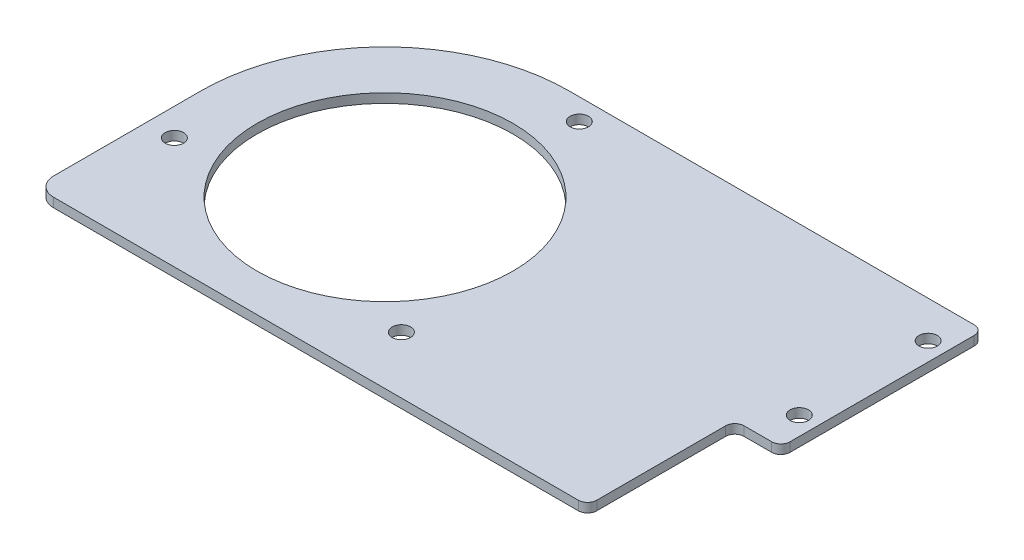
ISO-10303-21;
HEADER;
FILE_DESCRIPTION(('STEP AP214'),'2;1');
FILE_NAME('part.step','',(''),(''),'','','');
FILE_SCHEMA(('AUTOMOTIVE_DESIGN { 1 0 10303 214 1 1 1 1 }'));
ENDSEC;
DATA;
#1=APPLICATION_CONTEXT('core data for automotive mechanical design processes');
#2=APPLICATION_PROTOCOL_DEFINITION('international standard','automotive_design',2000,#1);
#3=PRODUCT_CONTEXT('',#1,'mechanical');
#4=PRODUCT('Part','Part','',(#3));
#5=PRODUCT_RELATED_PRODUCT_CATEGORY('part','',(#4));
#6=PRODUCT_DEFINITION_FORMATION('','',#4);
#7=PRODUCT_DEFINITION_CONTEXT('part definition',#1,'design');
#8=PRODUCT_DEFINITION('design','',#6,#7);
#9=PRODUCT_DEFINITION_SHAPE('','',#8);
#10=(LENGTH_UNIT() NAMED_UNIT(*) SI_UNIT(.MILLI.,.METRE.));
#11=(NAMED_UNIT(*) PLANE_ANGLE_UNIT() SI_UNIT($,.RADIAN.));
#12=(NAMED_UNIT(*) SI_UNIT($,.STERADIAN.) SOLID_ANGLE_UNIT());
#13=UNCERTAINTY_MEASURE_WITH_UNIT(LENGTH_MEASURE(1.E-05),#10,'distance_accuracy_value','');
#14=(GEOMETRIC_REPRESENTATION_CONTEXT(3) GLOBAL_UNCERTAINTY_ASSIGNED_CONTEXT((#13)) GLOBAL_UNIT_ASSIGNED_CONTEXT((#10,
#11,#12)) REPRESENTATION_CONTEXT('',''));
#15=CARTESIAN_POINT('',(0.,0.,0.));
#16=DIRECTION('',(0.,0.,1.));
#17=DIRECTION('',(1.,0.,0.));
#18=AXIS2_PLACEMENT_3D('',#15,#16,#17);
#19=CARTESIAN_POINT('',(-114.3,6.35,101.6));
#20=DIRECTION('',(0.,-1.,0.));
#21=DIRECTION('',(0.,0.,-1.));
#22=AXIS2_PLACEMENT_3D('',#19,#20,#21);
#23=PLANE('',#22);
#24=CARTESIAN_POINT('',(21.8094681715398,6.35,-112.199987068068));
#25=DIRECTION('',(0.,1.,0.));
#26=DIRECTION('',(0.,0.,1.));
#27=AXIS2_PLACEMENT_3D('',#24,#25,#26);
#28=CIRCLE('',#27,6.34999999999998);
#29=CARTESIAN_POINT('',(21.8094681715398,6.35,-105.849987068068));
#30=VERTEX_POINT('',#29);
#31=EDGE_CURVE('E307',#30,#30,#28,.T.);
#32=ORIENTED_EDGE('',*,*,#31,.F.);
#33=EDGE_LOOP('',(#32));
#34=FACE_BOUND('',#33,.T.);
#35=CARTESIAN_POINT('',(273.05,6.35,-101.6));
#36=DIRECTION('',(0.,1.,0.));
#37=DIRECTION('',(0.,0.,1.));
#38=AXIS2_PLACEMENT_3D('',#35,#36,#37);
#39=CIRCLE('',#38,6.35);
#40=CARTESIAN_POINT('',(273.05,6.35,-95.2500000000001));
#41=VERTEX_POINT('',#40);
#42=EDGE_CURVE('E297',#41,#41,#39,.T.);
#43=ORIENTED_EDGE('',*,*,#42,.F.);
#44=EDGE_LOOP('',(#43));
#45=FACE_BOUND('',#44,.T.);
#46=CARTESIAN_POINT('',(0.,6.35,0.));
#47=DIRECTION('',(0.,1.,0.));
#48=DIRECTION('',(0.,0.,1.));
#49=AXIS2_PLACEMENT_3D('',#46,#47,#48);
#50=CIRCLE('',#49,88.265);
#51=CARTESIAN_POINT('',(0.,6.35,88.265));
#52=VERTEX_POINT('',#51);
#53=EDGE_CURVE('E194',#52,#52,#50,.T.);
#54=ORIENTED_EDGE('',*,*,#53,.F.);
#55=EDGE_LOOP('',(#54));
#56=FACE_BOUND('',#55,.T.);
#57=CARTESIAN_POINT('',(-114.3,6.35,101.6));
#58=DIRECTION('',(0.,1.,0.));
#59=DIRECTION('',(0.,0.,-1.));
#60=AXIS2_PLACEMENT_3D('',#57,#58,#59);
#61=CIRCLE('',#60,12.7);
#62=CARTESIAN_POINT('',(-127.,6.35,101.6));
#63=VERTEX_POINT('',#62);
#64=CARTESIAN_POINT('',(-114.3,6.35,114.3));
#65=VERTEX_POINT('',#64);
#66=EDGE_CURVE('E224',#63,#65,#61,.T.);
#67=ORIENTED_EDGE('',*,*,#66,.T.);
#68=DIRECTION('',(1.,0.,0.));
#69=VECTOR('',#68,1.);
#70=CARTESIAN_POINT('',(247.65,6.35,114.3));
#71=LINE('',#70,#69);
#72=CARTESIAN_POINT('',(247.65,6.35,114.3));
#73=VERTEX_POINT('',#72);
#74=EDGE_CURVE('E127',#65,#73,#71,.T.);
#75=ORIENTED_EDGE('',*,*,#74,.T.);
#76=CARTESIAN_POINT('',(247.65,6.35,107.95));
#77=DIRECTION('',(0.,1.,0.));
#78=DIRECTION('',(0.,0.,1.));
#79=AXIS2_PLACEMENT_3D('',#76,#77,#78);
#80=CIRCLE('',#79,6.35000000000003);
#81=CARTESIAN_POINT('',(254.,6.35,107.95));
#82=VERTEX_POINT('',#81);
#83=EDGE_CURVE('E261',#73,#82,#80,.T.);
#84=ORIENTED_EDGE('',*,*,#83,.T.);
#85=DIRECTION('',(0.,0.,-1.));
#86=VECTOR('',#85,1.);
#87=CARTESIAN_POINT('',(254.,6.35,107.95));
#88=LINE('',#87,#86);
#89=CARTESIAN_POINT('',(254.,6.35,19.05));
#90=VERTEX_POINT('',#89);
#91=EDGE_CURVE('E281',#82,#90,#88,.T.);
#92=ORIENTED_EDGE('',*,*,#91,.T.);
#93=CARTESIAN_POINT('',(260.35,6.35,19.05));
#94=DIRECTION('',(0.,-1.,0.));
#95=DIRECTION('',(0.,0.,1.));
#96=AXIS2_PLACEMENT_3D('',#93,#94,#95);
#97=CIRCLE('',#96,6.35000000000001);
#98=CARTESIAN_POINT('',(260.35,6.35,12.7));
#99=VERTEX_POINT('',#98);
#100=EDGE_CURVE('E277',#90,#99,#97,.T.);
#101=ORIENTED_EDGE('',*,*,#100,.T.);
#102=DIRECTION('',(1.,0.,0.));
#103=VECTOR('',#102,1.);
#104=CARTESIAN_POINT('',(260.35,6.35,12.7));
#105=LINE('',#104,#103);
#106=CARTESIAN_POINT('',(279.4,6.35,12.7));
#107=VERTEX_POINT('',#106);
#108=EDGE_CURVE('E280',#99,#107,#105,.T.);
#109=ORIENTED_EDGE('',*,*,#108,.T.);
#110=CARTESIAN_POINT('',(279.4,6.35,6.35));
#111=DIRECTION('',(0.,1.,0.));
#112=DIRECTION('',(0.,0.,-1.));
#113=AXIS2_PLACEMENT_3D('',#110,#111,#112);
#114=CIRCLE('',#113,6.35000000000001);
#115=CARTESIAN_POINT('',(285.75,6.35,6.34999999999996));
#116=VERTEX_POINT('',#115);
#117=EDGE_CURVE('E285',#107,#116,#114,.T.);
#118=ORIENTED_EDGE('',*,*,#117,.T.);
#119=DIRECTION('',(0.,0.,-1.));
#120=VECTOR('',#119,1.);
#121=CARTESIAN_POINT('',(285.75,6.35,-120.65));
#122=LINE('',#121,#120);
#123=CARTESIAN_POINT('',(285.75,6.35,-120.65));
#124=VERTEX_POINT('',#123);
#125=EDGE_CURVE('E293',#116,#124,#122,.T.);
#126=ORIENTED_EDGE('',*,*,#125,.T.);
#127=CARTESIAN_POINT('',(279.4,6.35,-120.65));
#128=DIRECTION('',(0.,1.,0.));
#129=DIRECTION('',(0.,0.,-1.));
#130=AXIS2_PLACEMENT_3D('',#127,#128,#129);
#131=CIRCLE('',#130,6.35000000000001);
#132=CARTESIAN_POINT('',(279.4,6.35,-127.));
#133=VERTEX_POINT('',#132);
#134=EDGE_CURVE('E166',#124,#133,#131,.T.);
#135=ORIENTED_EDGE('',*,*,#134,.T.);
#136=DIRECTION('',(-1.,0.,0.));
#137=VECTOR('',#136,1.);
#138=CARTESIAN_POINT('',(279.4,6.35,-127.));
#139=LINE('',#138,#137);
#140=CARTESIAN_POINT('',(0.,6.35,-127.));
#141=VERTEX_POINT('',#140);
#142=EDGE_CURVE('E160',#133,#141,#139,.T.);
#143=ORIENTED_EDGE('',*,*,#142,.T.);
#144=CARTESIAN_POINT('',(0.,6.35,0.));
#145=DIRECTION('',(0.,1.,0.));
#146=DIRECTION('',(0.,0.,-1.));
#147=AXIS2_PLACEMENT_3D('',#144,#145,#146);
#148=CIRCLE('',#147,127.);
#149=CARTESIAN_POINT('',(-127.,6.35,0.));
#150=VERTEX_POINT('',#149);
#151=EDGE_CURVE('E164',#141,#150,#148,.T.);
#152=ORIENTED_EDGE('',*,*,#151,.T.);
#153=DIRECTION('',(0.,0.,1.));
#154=VECTOR('',#153,1.);
#155=CARTESIAN_POINT('',(-127.,6.35,0.));
#156=LINE('',#155,#154);
#157=EDGE_CURVE('E59',#150,#63,#156,.T.);
#158=ORIENTED_EDGE('',*,*,#157,.T.);
#159=EDGE_LOOP('',(#67,#75,#84,#92,#101,#109,#118,#126,#135,#143,#152,#158));
#160=FACE_BOUND('',#159,.T.);
#161=CARTESIAN_POINT('',(-108.072773191002,6.35,37.2124400544523));
#162=DIRECTION('',(0.,1.,0.));
#163=DIRECTION('',(0.,0.,1.));
#164=AXIS2_PLACEMENT_3D('',#161,#162,#163);
#165=CIRCLE('',#164,6.35);
#166=CARTESIAN_POINT('',(-108.072773191002,6.35,43.5624400544523));
#167=VERTEX_POINT('',#166);
#168=EDGE_CURVE('E321',#167,#167,#165,.T.);
#169=ORIENTED_EDGE('',*,*,#168,.F.);
#170=EDGE_LOOP('',(#169));
#171=FACE_BOUND('',#170,.T.);
#172=CARTESIAN_POINT('',(273.05,6.35,-12.7));
#173=DIRECTION('',(0.,1.,0.));
#174=DIRECTION('',(0.,0.,1.));
#175=AXIS2_PLACEMENT_3D('',#172,#173,#174);
#176=CIRCLE('',#175,6.35);
#177=CARTESIAN_POINT('',(273.05,6.35,-6.35));
#178=VERTEX_POINT('',#177);
#179=EDGE_CURVE('E304',#178,#178,#176,.T.);
#180=ORIENTED_EDGE('',*,*,#179,.F.);
#181=EDGE_LOOP('',(#180));
#182=FACE_BOUND('',#181,.T.);
#183=CARTESIAN_POINT('',(86.2633050194624,6.35,74.9875470136155));
#184=DIRECTION('',(0.,1.,0.));
#185=DIRECTION('',(0.,0.,1.));
#186=AXIS2_PLACEMENT_3D('',#183,#184,#185);
#187=CIRCLE('',#186,6.34999999999999);
#188=CARTESIAN_POINT('',(86.2633050194624,6.35,81.3375470136155));
#189=VERTEX_POINT('',#188);
#190=EDGE_CURVE('E315',#189,#189,#187,.T.);
#191=ORIENTED_EDGE('',*,*,#190,.F.);
#192=EDGE_LOOP('',(#191));
#193=FACE_BOUND('',#192,.T.);
#194=ADVANCED_FACE('F38',(#34,#45,#56,#160,#171,#182,#193),#23,.F.);
#195=CARTESIAN_POINT('',(-114.3,0.,101.6));
#196=DIRECTION('',(0.,-1.,0.));
#197=DIRECTION('',(0.,0.,-1.));
#198=AXIS2_PLACEMENT_3D('',#195,#196,#197);
#199=PLANE('',#198);
#200=CARTESIAN_POINT('',(21.8094681715398,0.,-112.199987068068));
#201=DIRECTION('',(0.,1.,0.));
#202=DIRECTION('',(0.,0.,1.));
#203=AXIS2_PLACEMENT_3D('',#200,#201,#202);
#204=CIRCLE('',#203,6.34999999999998);
#205=CARTESIAN_POINT('',(21.8094681715398,0.,-105.849987068068));
#206=VERTEX_POINT('',#205);
#207=EDGE_CURVE('E311',#206,#206,#204,.T.);
#208=ORIENTED_EDGE('',*,*,#207,.T.);
#209=EDGE_LOOP('',(#208));
#210=FACE_BOUND('',#209,.T.);
#211=CARTESIAN_POINT('',(273.05,0.,-101.6));
#212=DIRECTION('',(0.,1.,0.));
#213=DIRECTION('',(0.,0.,1.));
#214=AXIS2_PLACEMENT_3D('',#211,#212,#213);
#215=CIRCLE('',#214,6.35);
#216=CARTESIAN_POINT('',(273.05,0.,-95.2500000000001));
#217=VERTEX_POINT('',#216);
#218=EDGE_CURVE('E300',#217,#217,#215,.T.);
#219=ORIENTED_EDGE('',*,*,#218,.T.);
#220=EDGE_LOOP('',(#219));
#221=FACE_BOUND('',#220,.T.);
#222=CARTESIAN_POINT('',(0.,0.,0.));
#223=DIRECTION('',(0.,1.,0.));
#224=DIRECTION('',(0.,0.,1.));
#225=AXIS2_PLACEMENT_3D('',#222,#223,#224);
#226=CIRCLE('',#225,88.265);
#227=CARTESIAN_POINT('',(0.,0.,88.265));
#228=VERTEX_POINT('',#227);
#229=EDGE_CURVE('E318',#228,#228,#226,.T.);
#230=ORIENTED_EDGE('',*,*,#229,.T.);
#231=EDGE_LOOP('',(#230));
#232=FACE_BOUND('',#231,.T.);
#233=CARTESIAN_POINT('',(-114.3,0.,101.6));
#234=DIRECTION('',(0.,1.,0.));
#235=DIRECTION('',(0.,0.,-1.));
#236=AXIS2_PLACEMENT_3D('',#233,#234,#235);
#237=CIRCLE('',#236,12.7);
#238=CARTESIAN_POINT('',(-127.,0.,101.6));
#239=VERTEX_POINT('',#238);
#240=CARTESIAN_POINT('',(-114.3,0.,114.3));
#241=VERTEX_POINT('',#240);
#242=EDGE_CURVE('E189',#239,#241,#237,.T.);
#243=ORIENTED_EDGE('',*,*,#242,.F.);
#244=DIRECTION('',(0.,0.,1.));
#245=VECTOR('',#244,1.);
#246=CARTESIAN_POINT('',(-127.,0.,0.));
#247=LINE('',#246,#245);
#248=CARTESIAN_POINT('',(-127.,0.,0.));
#249=VERTEX_POINT('',#248);
#250=EDGE_CURVE('E119',#249,#239,#247,.T.);
#251=ORIENTED_EDGE('',*,*,#250,.F.);
#252=CARTESIAN_POINT('',(0.,0.,0.));
#253=DIRECTION('',(0.,1.,0.));
#254=DIRECTION('',(0.,0.,-1.));
#255=AXIS2_PLACEMENT_3D('',#252,#253,#254);
#256=CIRCLE('',#255,127.);
#257=CARTESIAN_POINT('',(0.,0.,-127.));
#258=VERTEX_POINT('',#257);
#259=EDGE_CURVE('E112',#258,#249,#256,.T.);
#260=ORIENTED_EDGE('',*,*,#259,.F.);
#261=DIRECTION('',(-1.,0.,0.));
#262=VECTOR('',#261,1.);
#263=CARTESIAN_POINT('',(279.4,0.,-127.));
#264=LINE('',#263,#262);
#265=CARTESIAN_POINT('',(279.4,0.,-127.));
#266=VERTEX_POINT('',#265);
#267=EDGE_CURVE('E175',#266,#258,#264,.T.);
#268=ORIENTED_EDGE('',*,*,#267,.F.);
#269=CARTESIAN_POINT('',(279.4,0.,-120.65));
#270=DIRECTION('',(0.,1.,0.));
#271=DIRECTION('',(0.,0.,-1.));
#272=AXIS2_PLACEMENT_3D('',#269,#270,#271);
#273=CIRCLE('',#272,6.35000000000001);
#274=CARTESIAN_POINT('',(285.75,0.,-120.65));
#275=VERTEX_POINT('',#274);
#276=EDGE_CURVE('E215',#275,#266,#273,.T.);
#277=ORIENTED_EDGE('',*,*,#276,.F.);
#278=DIRECTION('',(0.,0.,-1.));
#279=VECTOR('',#278,1.);
#280=CARTESIAN_POINT('',(285.75,0.,-120.65));
#281=LINE('',#280,#279);
#282=CARTESIAN_POINT('',(285.75,0.,6.34999999999996));
#283=VERTEX_POINT('',#282);
#284=EDGE_CURVE('E212',#283,#275,#281,.T.);
#285=ORIENTED_EDGE('',*,*,#284,.F.);
#286=CARTESIAN_POINT('',(279.4,0.,6.35));
#287=DIRECTION('',(0.,1.,0.));
#288=DIRECTION('',(0.,0.,-1.));
#289=AXIS2_PLACEMENT_3D('',#286,#287,#288);
#290=CIRCLE('',#289,6.35000000000001);
#291=CARTESIAN_POINT('',(279.4,0.,12.7));
#292=VERTEX_POINT('',#291);
#293=EDGE_CURVE('E209',#292,#283,#290,.T.);
#294=ORIENTED_EDGE('',*,*,#293,.F.);
#295=DIRECTION('',(1.,0.,0.));
#296=VECTOR('',#295,1.);
#297=CARTESIAN_POINT('',(260.35,0.,12.7));
#298=LINE('',#297,#296);
#299=CARTESIAN_POINT('',(260.35,0.,12.7));
#300=VERTEX_POINT('',#299);
#301=EDGE_CURVE('E206',#300,#292,#298,.T.);
#302=ORIENTED_EDGE('',*,*,#301,.F.);
#303=CARTESIAN_POINT('',(260.35,0.,19.05));
#304=DIRECTION('',(0.,-1.,0.));
#305=DIRECTION('',(0.,0.,1.));
#306=AXIS2_PLACEMENT_3D('',#303,#304,#305);
#307=CIRCLE('',#306,6.35000000000001);
#308=CARTESIAN_POINT('',(254.,0.,19.05));
#309=VERTEX_POINT('',#308);
#310=EDGE_CURVE('E203',#309,#300,#307,.T.);
#311=ORIENTED_EDGE('',*,*,#310,.F.);
#312=DIRECTION('',(0.,0.,-1.));
#313=VECTOR('',#312,1.);
#314=CARTESIAN_POINT('',(254.,0.,107.95));
#315=LINE('',#314,#313);
#316=CARTESIAN_POINT('',(254.,0.,107.95));
#317=VERTEX_POINT('',#316);
#318=EDGE_CURVE('E200',#317,#309,#315,.T.);
#319=ORIENTED_EDGE('',*,*,#318,.F.);
#320=CARTESIAN_POINT('',(247.65,0.,107.95));
#321=DIRECTION('',(0.,1.,0.));
#322=DIRECTION('',(0.,0.,1.));
#323=AXIS2_PLACEMENT_3D('',#320,#321,#322);
#324=CIRCLE('',#323,6.35000000000003);
#325=CARTESIAN_POINT('',(247.65,0.,114.3));
#326=VERTEX_POINT('',#325);
#327=EDGE_CURVE('E197',#326,#317,#324,.T.);
#328=ORIENTED_EDGE('',*,*,#327,.F.);
#329=DIRECTION('',(1.,0.,0.));
#330=VECTOR('',#329,1.);
#331=CARTESIAN_POINT('',(247.65,0.,114.3));
#332=LINE('',#331,#330);
#333=EDGE_CURVE('E193',#241,#326,#332,.T.);
#334=ORIENTED_EDGE('',*,*,#333,.F.);
#335=EDGE_LOOP('',(#243,#251,#260,#268,#277,#285,#294,#302,#311,#319,#328,#334));
#336=FACE_BOUND('',#335,.T.);
#337=CARTESIAN_POINT('',(-108.072773191002,0.,37.2124400544523));
#338=DIRECTION('',(0.,1.,0.));
#339=DIRECTION('',(0.,0.,1.));
#340=AXIS2_PLACEMENT_3D('',#337,#338,#339);
#341=CIRCLE('',#340,6.35);
#342=CARTESIAN_POINT('',(-108.072773191002,0.,43.5624400544523));
#343=VERTEX_POINT('',#342);
#344=EDGE_CURVE('E299',#343,#343,#341,.T.);
#345=ORIENTED_EDGE('',*,*,#344,.T.);
#346=EDGE_LOOP('',(#345));
#347=FACE_BOUND('',#346,.T.);
#348=CARTESIAN_POINT('',(273.05,0.,-12.7));
#349=DIRECTION('',(0.,1.,0.));
#350=DIRECTION('',(0.,0.,1.));
#351=AXIS2_PLACEMENT_3D('',#348,#349,#350);
#352=CIRCLE('',#351,6.35);
#353=CARTESIAN_POINT('',(273.05,0.,-6.35));
#354=VERTEX_POINT('',#353);
#355=EDGE_CURVE('E310',#354,#354,#352,.T.);
#356=ORIENTED_EDGE('',*,*,#355,.T.);
#357=EDGE_LOOP('',(#356));
#358=FACE_BOUND('',#357,.T.);
#359=CARTESIAN_POINT('',(86.2633050194624,0.,74.9875470136155));
#360=DIRECTION('',(0.,1.,0.));
#361=DIRECTION('',(0.,0.,1.));
#362=AXIS2_PLACEMENT_3D('',#359,#360,#361);
#363=CIRCLE('',#362,6.34999999999999);
#364=CARTESIAN_POINT('',(86.2633050194624,0.,81.3375470136155));
#365=VERTEX_POINT('',#364);
#366=EDGE_CURVE('E531',#365,#365,#363,.T.);
#367=ORIENTED_EDGE('',*,*,#366,.T.);
#368=EDGE_LOOP('',(#367));
#369=FACE_BOUND('',#368,.T.);
#370=ADVANCED_FACE('F265',(#210,#221,#232,#336,#347,#358,#369),#199,.T.);
#371=CARTESIAN_POINT('',(-114.3,6.35,101.6));
#372=DIRECTION('',(0.,-1.,0.));
#373=DIRECTION('',(0.,0.,-1.));
#374=AXIS2_PLACEMENT_3D('',#371,#372,#373);
#375=CYLINDRICAL_SURFACE('',#374,12.7);
#376=ORIENTED_EDGE('',*,*,#242,.T.);
#377=DIRECTION('',(0.,-1.,0.));
#378=VECTOR('',#377,1.);
#379=CARTESIAN_POINT('',(-114.3,6.35,114.3));
#380=LINE('',#379,#378);
#381=EDGE_CURVE('E11',#65,#241,#380,.T.);
#382=ORIENTED_EDGE('',*,*,#381,.F.);
#383=ORIENTED_EDGE('',*,*,#66,.F.);
#384=DIRECTION('',(0.,-1.,0.));
#385=VECTOR('',#384,1.);
#386=CARTESIAN_POINT('',(-127.,6.35,101.6));
#387=LINE('',#386,#385);
#388=EDGE_CURVE('E185',#63,#239,#387,.T.);
#389=ORIENTED_EDGE('',*,*,#388,.T.);
#390=EDGE_LOOP('',(#376,#382,#383,#389));
#391=FACE_BOUND('',#390,.T.);
#392=ADVANCED_FACE('F40',(#391),#375,.T.);
#393=CARTESIAN_POINT('',(247.65,6.35,114.3));
#394=DIRECTION('',(0.,0.,-1.));
#395=DIRECTION('',(-1.,0.,0.));
#396=AXIS2_PLACEMENT_3D('',#393,#394,#395);
#397=PLANE('',#396);
#398=ORIENTED_EDGE('',*,*,#333,.T.);
#399=DIRECTION('',(0.,-1.,0.));
#400=VECTOR('',#399,1.);
#401=CARTESIAN_POINT('',(247.65,6.35,114.3));
#402=LINE('',#401,#400);
#403=EDGE_CURVE('E48',#73,#326,#402,.T.);
#404=ORIENTED_EDGE('',*,*,#403,.F.);
#405=ORIENTED_EDGE('',*,*,#74,.F.);
#406=ORIENTED_EDGE('',*,*,#381,.T.);
#407=EDGE_LOOP('',(#398,#404,#405,#406));
#408=FACE_BOUND('',#407,.T.);
#409=ADVANCED_FACE('F337',(#408),#397,.F.);
#410=CARTESIAN_POINT('',(247.65,6.35,107.95));
#411=DIRECTION('',(0.,-1.,0.));
#412=DIRECTION('',(0.,0.,-1.));
#413=AXIS2_PLACEMENT_3D('',#410,#411,#412);
#414=CYLINDRICAL_SURFACE('',#413,6.35000000000003);
#415=ORIENTED_EDGE('',*,*,#327,.T.);
#416=DIRECTION('',(0.,-1.,0.));
#417=VECTOR('',#416,1.);
#418=CARTESIAN_POINT('',(254.,6.35,107.95));
#419=LINE('',#418,#417);
#420=EDGE_CURVE('E251',#82,#317,#419,.T.);
#421=ORIENTED_EDGE('',*,*,#420,.F.);
#422=ORIENTED_EDGE('',*,*,#83,.F.);
#423=ORIENTED_EDGE('',*,*,#403,.T.);
#424=EDGE_LOOP('',(#415,#421,#422,#423));
#425=FACE_BOUND('',#424,.T.);
#426=ADVANCED_FACE('F259',(#425),#414,.T.);
#427=CARTESIAN_POINT('',(254.,6.35,107.95));
#428=DIRECTION('',(-1.,0.,0.));
#429=DIRECTION('',(0.,0.,1.));
#430=AXIS2_PLACEMENT_3D('',#427,#428,#429);
#431=PLANE('',#430);
#432=ORIENTED_EDGE('',*,*,#318,.T.);
#433=DIRECTION('',(0.,-1.,0.));
#434=VECTOR('',#433,1.);
#435=CARTESIAN_POINT('',(254.,6.35,19.05));
#436=LINE('',#435,#434);
#437=EDGE_CURVE('E247',#90,#309,#436,.T.);
#438=ORIENTED_EDGE('',*,*,#437,.F.);
#439=ORIENTED_EDGE('',*,*,#91,.F.);
#440=ORIENTED_EDGE('',*,*,#420,.T.);
#441=EDGE_LOOP('',(#432,#438,#439,#440));
#442=FACE_BOUND('',#441,.T.);
#443=ADVANCED_FACE('F271',(#442),#431,.F.);
#444=CARTESIAN_POINT('',(260.35,6.35,19.05));
#445=DIRECTION('',(0.,-1.,0.));
#446=DIRECTION('',(0.,0.,-1.));
#447=AXIS2_PLACEMENT_3D('',#444,#445,#446);
#448=CYLINDRICAL_SURFACE('',#447,6.35000000000001);
#449=ORIENTED_EDGE('',*,*,#310,.T.);
#450=DIRECTION('',(0.,-1.,0.));
#451=VECTOR('',#450,1.);
#452=CARTESIAN_POINT('',(260.35,6.35,12.7));
#453=LINE('',#452,#451);
#454=EDGE_CURVE('E243',#99,#300,#453,.T.);
#455=ORIENTED_EDGE('',*,*,#454,.F.);
#456=ORIENTED_EDGE('',*,*,#100,.F.);
#457=ORIENTED_EDGE('',*,*,#437,.T.);
#458=EDGE_LOOP('',(#449,#455,#456,#457));
#459=FACE_BOUND('',#458,.T.);
#460=ADVANCED_FACE('F275',(#459),#448,.F.);
#461=CARTESIAN_POINT('',(260.35,6.35,12.7));
#462=DIRECTION('',(0.,0.,-1.));
#463=DIRECTION('',(-1.,0.,0.));
#464=AXIS2_PLACEMENT_3D('',#461,#462,#463);
#465=PLANE('',#464);
#466=ORIENTED_EDGE('',*,*,#301,.T.);
#467=DIRECTION('',(0.,-1.,0.));
#468=VECTOR('',#467,1.);
#469=CARTESIAN_POINT('',(279.4,6.35,12.7));
#470=LINE('',#469,#468);
#471=EDGE_CURVE('E239',#107,#292,#470,.T.);
#472=ORIENTED_EDGE('',*,*,#471,.F.);
#473=ORIENTED_EDGE('',*,*,#108,.F.);
#474=ORIENTED_EDGE('',*,*,#454,.T.);
#475=EDGE_LOOP('',(#466,#472,#473,#474));
#476=FACE_BOUND('',#475,.T.);
#477=ADVANCED_FACE('F376',(#476),#465,.F.);
#478=CARTESIAN_POINT('',(279.4,6.35,6.35));
#479=DIRECTION('',(0.,-1.,0.));
#480=DIRECTION('',(0.,0.,-1.));
#481=AXIS2_PLACEMENT_3D('',#478,#479,#480);
#482=CYLINDRICAL_SURFACE('',#481,6.35000000000001);
#483=ORIENTED_EDGE('',*,*,#293,.T.);
#484=DIRECTION('',(0.,-1.,0.));
#485=VECTOR('',#484,1.);
#486=CARTESIAN_POINT('',(285.75,6.35,6.34999999999996));
#487=LINE('',#486,#485);
#488=EDGE_CURVE('E235',#116,#283,#487,.T.);
#489=ORIENTED_EDGE('',*,*,#488,.F.);
#490=ORIENTED_EDGE('',*,*,#117,.F.);
#491=ORIENTED_EDGE('',*,*,#471,.T.);
#492=EDGE_LOOP('',(#483,#489,#490,#491));
#493=FACE_BOUND('',#492,.T.);
#494=ADVANCED_FACE('F372',(#493),#482,.T.);
#495=CARTESIAN_POINT('',(285.75,6.35,-120.65));
#496=DIRECTION('',(-1.,0.,0.));
#497=DIRECTION('',(0.,0.,1.));
#498=AXIS2_PLACEMENT_3D('',#495,#496,#497);
#499=PLANE('',#498);
#500=ORIENTED_EDGE('',*,*,#284,.T.);
#501=DIRECTION('',(0.,-1.,0.));
#502=VECTOR('',#501,1.);
#503=CARTESIAN_POINT('',(285.75,6.35,-120.65));
#504=LINE('',#503,#502);
#505=EDGE_CURVE('E231',#124,#275,#504,.T.);
#506=ORIENTED_EDGE('',*,*,#505,.F.);
#507=ORIENTED_EDGE('',*,*,#125,.F.);
#508=ORIENTED_EDGE('',*,*,#488,.T.);
#509=EDGE_LOOP('',(#500,#506,#507,#508));
#510=FACE_BOUND('',#509,.T.);
#511=ADVANCED_FACE('F368',(#510),#499,.F.);
#512=CARTESIAN_POINT('',(279.4,6.35,-120.65));
#513=DIRECTION('',(0.,-1.,0.));
#514=DIRECTION('',(0.,0.,-1.));
#515=AXIS2_PLACEMENT_3D('',#512,#513,#514);
#516=CYLINDRICAL_SURFACE('',#515,6.35000000000001);
#517=ORIENTED_EDGE('',*,*,#276,.T.);
#518=DIRECTION('',(0.,-1.,0.));
#519=VECTOR('',#518,1.);
#520=CARTESIAN_POINT('',(279.4,6.35,-127.));
#521=LINE('',#520,#519);
#522=EDGE_CURVE('E177',#133,#266,#521,.T.);
#523=ORIENTED_EDGE('',*,*,#522,.F.);
#524=ORIENTED_EDGE('',*,*,#134,.F.);
#525=ORIENTED_EDGE('',*,*,#505,.T.);
#526=EDGE_LOOP('',(#517,#523,#524,#525));
#527=FACE_BOUND('',#526,.T.);
#528=ADVANCED_FACE('F365',(#527),#516,.T.);
#529=CARTESIAN_POINT('',(279.4,6.35,-127.));
#530=DIRECTION('',(0.,0.,1.));
#531=DIRECTION('',(1.,0.,0.));
#532=AXIS2_PLACEMENT_3D('',#529,#530,#531);
#533=PLANE('',#532);
#534=ORIENTED_EDGE('',*,*,#267,.T.);
#535=DIRECTION('',(0.,-1.,0.));
#536=VECTOR('',#535,1.);
#537=CARTESIAN_POINT('',(0.,6.35,-127.));
#538=LINE('',#537,#536);
#539=EDGE_CURVE('E172',#141,#258,#538,.T.);
#540=ORIENTED_EDGE('',*,*,#539,.F.);
#541=ORIENTED_EDGE('',*,*,#142,.F.);
#542=ORIENTED_EDGE('',*,*,#522,.T.);
#543=EDGE_LOOP('',(#534,#540,#541,#542));
#544=FACE_BOUND('',#543,.T.);
#545=ADVANCED_FACE('F173',(#544),#533,.F.);
#546=CARTESIAN_POINT('',(0.,6.35,0.));
#547=DIRECTION('',(0.,-1.,0.));
#548=DIRECTION('',(0.,0.,-1.));
#549=AXIS2_PLACEMENT_3D('',#546,#547,#548);
#550=CYLINDRICAL_SURFACE('',#549,127.);
#551=ORIENTED_EDGE('',*,*,#259,.T.);
#552=DIRECTION('',(0.,-1.,0.));
#553=VECTOR('',#552,1.);
#554=CARTESIAN_POINT('',(-127.,6.35,0.));
#555=LINE('',#554,#553);
#556=EDGE_CURVE('E178',#150,#249,#555,.T.);
#557=ORIENTED_EDGE('',*,*,#556,.F.);
#558=ORIENTED_EDGE('',*,*,#151,.F.);
#559=ORIENTED_EDGE('',*,*,#539,.T.);
#560=EDGE_LOOP('',(#551,#557,#558,#559));
#561=FACE_BOUND('',#560,.T.);
#562=ADVANCED_FACE('F180',(#561),#550,.T.);
#563=CARTESIAN_POINT('',(-127.,6.35,0.));
#564=DIRECTION('',(1.,0.,0.));
#565=DIRECTION('',(0.,0.,-1.));
#566=AXIS2_PLACEMENT_3D('',#563,#564,#565);
#567=PLANE('',#566);
#568=ORIENTED_EDGE('',*,*,#250,.T.);
#569=ORIENTED_EDGE('',*,*,#388,.F.);
#570=ORIENTED_EDGE('',*,*,#157,.F.);
#571=ORIENTED_EDGE('',*,*,#556,.T.);
#572=EDGE_LOOP('',(#568,#569,#570,#571));
#573=FACE_BOUND('',#572,.T.);
#574=ADVANCED_FACE('F358',(#573),#567,.F.);
#575=CARTESIAN_POINT('',(0.,6.35,0.));
#576=DIRECTION('',(0.,-1.,0.));
#577=DIRECTION('',(0.,0.,-1.));
#578=AXIS2_PLACEMENT_3D('',#575,#576,#577);
#579=CYLINDRICAL_SURFACE('',#578,88.265);
#580=ORIENTED_EDGE('',*,*,#53,.T.);
#581=EDGE_LOOP('',(#580));
#582=FACE_BOUND('',#581,.T.);
#583=ORIENTED_EDGE('',*,*,#229,.F.);
#584=EDGE_LOOP('',(#583));
#585=FACE_BOUND('',#584,.T.);
#586=ADVANCED_FACE('F355',(#582,#585),#579,.F.);
#587=CARTESIAN_POINT('',(-108.072773191002,6.35,37.2124400544523));
#588=DIRECTION('',(0.,-1.,0.));
#589=DIRECTION('',(0.,0.,-1.));
#590=AXIS2_PLACEMENT_3D('',#587,#588,#589);
#591=CYLINDRICAL_SURFACE('',#590,6.35);
#592=ORIENTED_EDGE('',*,*,#168,.T.);
#593=EDGE_LOOP('',(#592));
#594=FACE_BOUND('',#593,.T.);
#595=ORIENTED_EDGE('',*,*,#344,.F.);
#596=EDGE_LOOP('',(#595));
#597=FACE_BOUND('',#596,.T.);
#598=ADVANCED_FACE('F426',(#594,#597),#591,.F.);
#599=CARTESIAN_POINT('',(273.05,6.35,-101.6));
#600=DIRECTION('',(0.,-1.,0.));
#601=DIRECTION('',(0.,0.,-1.));
#602=AXIS2_PLACEMENT_3D('',#599,#600,#601);
#603=CYLINDRICAL_SURFACE('',#602,6.35);
#604=ORIENTED_EDGE('',*,*,#42,.T.);
#605=EDGE_LOOP('',(#604));
#606=FACE_BOUND('',#605,.T.);
#607=ORIENTED_EDGE('',*,*,#218,.F.);
#608=EDGE_LOOP('',(#607));
#609=FACE_BOUND('',#608,.T.);
#610=ADVANCED_FACE('F433',(#606,#609),#603,.F.);
#611=CARTESIAN_POINT('',(273.05,6.35,-12.7));
#612=DIRECTION('',(0.,-1.,0.));
#613=DIRECTION('',(0.,0.,-1.));
#614=AXIS2_PLACEMENT_3D('',#611,#612,#613);
#615=CYLINDRICAL_SURFACE('',#614,6.35);
#616=ORIENTED_EDGE('',*,*,#179,.T.);
#617=EDGE_LOOP('',(#616));
#618=FACE_BOUND('',#617,.T.);
#619=ORIENTED_EDGE('',*,*,#355,.F.);
#620=EDGE_LOOP('',(#619));
#621=FACE_BOUND('',#620,.T.);
#622=ADVANCED_FACE('F441',(#618,#621),#615,.F.);
#623=CARTESIAN_POINT('',(21.8094681715398,6.35,-112.199987068068));
#624=DIRECTION('',(0.,-1.,0.));
#625=DIRECTION('',(0.,0.,-1.));
#626=AXIS2_PLACEMENT_3D('',#623,#624,#625);
#627=CYLINDRICAL_SURFACE('',#626,6.34999999999998);
#628=ORIENTED_EDGE('',*,*,#31,.T.);
#629=EDGE_LOOP('',(#628));
#630=FACE_BOUND('',#629,.T.);
#631=ORIENTED_EDGE('',*,*,#207,.F.);
#632=EDGE_LOOP('',(#631));
#633=FACE_BOUND('',#632,.T.);
#634=ADVANCED_FACE('F447',(#630,#633),#627,.F.);
#635=CARTESIAN_POINT('',(86.2633050194624,6.35,74.9875470136155));
#636=DIRECTION('',(0.,-1.,0.));
#637=DIRECTION('',(0.,0.,-1.));
#638=AXIS2_PLACEMENT_3D('',#635,#636,#637);
#639=CYLINDRICAL_SURFACE('',#638,6.34999999999999);
#640=ORIENTED_EDGE('',*,*,#190,.T.);
#641=EDGE_LOOP('',(#640));
#642=FACE_BOUND('',#641,.T.);
#643=ORIENTED_EDGE('',*,*,#366,.F.);
#644=EDGE_LOOP('',(#643));
#645=FACE_BOUND('',#644,.T.);
#646=ADVANCED_FACE('F455',(#642,#645),#639,.F.);
#647=CLOSED_SHELL('',(#194,#370,#392,#409,#426,#443,#460,#477,#494,#511,#528,#545,#562,#574,
#586,#598,#610,#622,#634,#646));
#648=MANIFOLD_SOLID_BREP('B2',#647);
#649=ADVANCED_BREP_SHAPE_REPRESENTATION('',(#18,#648),#14);
#650=SHAPE_DEFINITION_REPRESENTATION(#9,#649);
ENDSEC;
END-ISO-10303-21;
